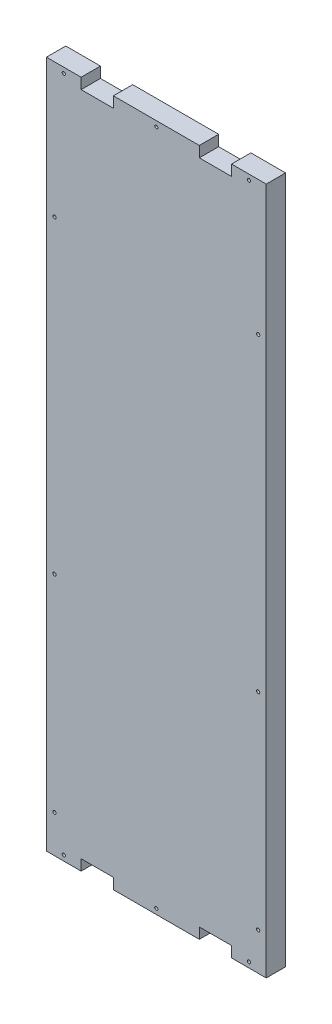
ISO-10303-21;
HEADER;
FILE_DESCRIPTION(('STEP AP214'),'2;1');
FILE_NAME('part.step','',(''),(''),'','','');
FILE_SCHEMA(('AUTOMOTIVE_DESIGN { 1 0 10303 214 1 1 1 1 }'));
ENDSEC;
DATA;
#1=APPLICATION_CONTEXT('core data for automotive mechanical design processes');
#2=APPLICATION_PROTOCOL_DEFINITION('international standard','automotive_design',2000,#1);
#3=PRODUCT_CONTEXT('',#1,'mechanical');
#4=PRODUCT('Part','Part','',(#3));
#5=PRODUCT_RELATED_PRODUCT_CATEGORY('part','',(#4));
#6=PRODUCT_DEFINITION_FORMATION('','',#4);
#7=PRODUCT_DEFINITION_CONTEXT('part definition',#1,'design');
#8=PRODUCT_DEFINITION('design','',#6,#7);
#9=PRODUCT_DEFINITION_SHAPE('','',#8);
#10=(LENGTH_UNIT() NAMED_UNIT(*) SI_UNIT(.MILLI.,.METRE.));
#11=(NAMED_UNIT(*) PLANE_ANGLE_UNIT() SI_UNIT($,.RADIAN.));
#12=(NAMED_UNIT(*) SI_UNIT($,.STERADIAN.) SOLID_ANGLE_UNIT());
#13=UNCERTAINTY_MEASURE_WITH_UNIT(LENGTH_MEASURE(1.E-05),#10,'distance_accuracy_value','');
#14=(GEOMETRIC_REPRESENTATION_CONTEXT(3) GLOBAL_UNCERTAINTY_ASSIGNED_CONTEXT((#13)) GLOBAL_UNIT_ASSIGNED_CONTEXT((#10,
#11,#12)) REPRESENTATION_CONTEXT('',''));
#15=CARTESIAN_POINT('',(0.,0.,0.));
#16=DIRECTION('',(0.,0.,1.));
#17=DIRECTION('',(1.,0.,0.));
#18=AXIS2_PLACEMENT_3D('',#15,#16,#17);
#19=CARTESIAN_POINT('',(-5.29999999999925,-36.5,18.));
#20=DIRECTION('',(0.,1.,0.));
#21=DIRECTION('',(0.,0.,1.));
#22=AXIS2_PLACEMENT_3D('',#19,#20,#21);
#23=PLANE('',#22);
#24=DIRECTION('',(1.,0.,0.));
#25=VECTOR('',#24,1.);
#26=CARTESIAN_POINT('',(-5.29999999999925,-36.5,18.));
#27=LINE('',#26,#25);
#28=CARTESIAN_POINT('',(167.000000000001,-36.5,18.));
#29=VERTEX_POINT('',#28);
#30=CARTESIAN_POINT('',(199.300000000001,-36.5,18.));
#31=VERTEX_POINT('',#30);
#32=EDGE_CURVE('E335',#29,#31,#27,.T.);
#33=ORIENTED_EDGE('',*,*,#32,.F.);
#34=DIRECTION('',(0.,0.,-1.));
#35=VECTOR('',#34,1.);
#36=CARTESIAN_POINT('',(167.000000000001,-36.5,18.));
#37=LINE('',#36,#35);
#38=CARTESIAN_POINT('',(167.000000000001,-36.5,0.));
#39=VERTEX_POINT('',#38);
#40=EDGE_CURVE('E244',#29,#39,#37,.T.);
#41=ORIENTED_EDGE('',*,*,#40,.T.);
#42=DIRECTION('',(1.,0.,0.));
#43=VECTOR('',#42,1.);
#44=CARTESIAN_POINT('',(-5.29999999999925,-36.5,0.));
#45=LINE('',#44,#43);
#46=CARTESIAN_POINT('',(199.300000000001,-36.5,0.));
#47=VERTEX_POINT('',#46);
#48=EDGE_CURVE('E353',#39,#47,#45,.T.);
#49=ORIENTED_EDGE('',*,*,#48,.T.);
#50=DIRECTION('',(0.,0.,-1.));
#51=VECTOR('',#50,1.);
#52=CARTESIAN_POINT('',(199.300000000001,-36.5,18.));
#53=LINE('',#52,#51);
#54=EDGE_CURVE('E48',#31,#47,#53,.T.);
#55=ORIENTED_EDGE('',*,*,#54,.F.);
#56=EDGE_LOOP('',(#33,#41,#49,#55));
#57=FACE_BOUND('',#56,.T.);
#58=ADVANCED_FACE('F39',(#57),#23,.F.);
#59=CARTESIAN_POINT('',(-5.29999999999925,-36.5,0.));
#60=VERTEX_POINT('',#59);
#61=CARTESIAN_POINT('',(27.0000000000007,-36.5,0.));
#62=VERTEX_POINT('',#61);
#63=EDGE_CURVE('E354',#60,#62,#45,.T.);
#64=ORIENTED_EDGE('',*,*,#63,.T.);
#65=DIRECTION('',(0.,0.,-1.));
#66=VECTOR('',#65,1.);
#67=CARTESIAN_POINT('',(27.0000000000007,-36.5,18.));
#68=LINE('',#67,#66);
#69=CARTESIAN_POINT('',(27.0000000000007,-36.5,18.));
#70=VERTEX_POINT('',#69);
#71=EDGE_CURVE('E318',#70,#62,#68,.T.);
#72=ORIENTED_EDGE('',*,*,#71,.F.);
#73=CARTESIAN_POINT('',(-5.29999999999925,-36.5,18.));
#74=VERTEX_POINT('',#73);
#75=EDGE_CURVE('E337',#74,#70,#27,.T.);
#76=ORIENTED_EDGE('',*,*,#75,.F.);
#77=DIRECTION('',(0.,0.,-1.));
#78=VECTOR('',#77,1.);
#79=CARTESIAN_POINT('',(-5.29999999999925,-36.5,18.));
#80=LINE('',#79,#78);
#81=EDGE_CURVE('E11',#74,#60,#80,.T.);
#82=ORIENTED_EDGE('',*,*,#81,.T.);
#83=EDGE_LOOP('',(#64,#72,#76,#82));
#84=FACE_BOUND('',#83,.T.);
#85=ADVANCED_FACE('F401',(#84),#23,.F.);
#86=CARTESIAN_POINT('',(-5.29999999999926,603.5,18.));
#87=DIRECTION('',(0.,-1.,0.));
#88=DIRECTION('',(0.,0.,-1.));
#89=AXIS2_PLACEMENT_3D('',#86,#87,#88);
#90=PLANE('',#89);
#91=DIRECTION('',(-1.,0.,0.));
#92=VECTOR('',#91,1.);
#93=CARTESIAN_POINT('',(-5.29999999999926,603.5,18.));
#94=LINE('',#93,#92);
#95=CARTESIAN_POINT('',(27.0000000000007,603.5,18.));
#96=VERTEX_POINT('',#95);
#97=CARTESIAN_POINT('',(-5.29999999999926,603.5,18.));
#98=VERTEX_POINT('',#97);
#99=EDGE_CURVE('E345',#96,#98,#94,.T.);
#100=ORIENTED_EDGE('',*,*,#99,.F.);
#101=DIRECTION('',(0.,0.,-1.));
#102=VECTOR('',#101,1.);
#103=CARTESIAN_POINT('',(27.0000000000007,603.5,18.));
#104=LINE('',#103,#102);
#105=CARTESIAN_POINT('',(27.0000000000007,603.5,0.));
#106=VERTEX_POINT('',#105);
#107=EDGE_CURVE('E250',#96,#106,#104,.T.);
#108=ORIENTED_EDGE('',*,*,#107,.T.);
#109=DIRECTION('',(-1.,0.,0.));
#110=VECTOR('',#109,1.);
#111=CARTESIAN_POINT('',(-5.29999999999926,603.5,0.));
#112=LINE('',#111,#110);
#113=CARTESIAN_POINT('',(-5.29999999999926,603.5,0.));
#114=VERTEX_POINT('',#113);
#115=EDGE_CURVE('E362',#106,#114,#112,.T.);
#116=ORIENTED_EDGE('',*,*,#115,.T.);
#117=DIRECTION('',(0.,0.,-1.));
#118=VECTOR('',#117,1.);
#119=CARTESIAN_POINT('',(-5.29999999999926,603.5,18.));
#120=LINE('',#119,#118);
#121=EDGE_CURVE('E348',#98,#114,#120,.T.);
#122=ORIENTED_EDGE('',*,*,#121,.F.);
#123=EDGE_LOOP('',(#100,#108,#116,#122));
#124=FACE_BOUND('',#123,.T.);
#125=ADVANCED_FACE('F392',(#124),#90,.F.);
#126=CARTESIAN_POINT('',(199.300000000001,603.5,0.));
#127=VERTEX_POINT('',#126);
#128=CARTESIAN_POINT('',(167.000000000001,603.5,0.));
#129=VERTEX_POINT('',#128);
#130=EDGE_CURVE('E336',#127,#129,#112,.T.);
#131=ORIENTED_EDGE('',*,*,#130,.T.);
#132=DIRECTION('',(0.,0.,-1.));
#133=VECTOR('',#132,1.);
#134=CARTESIAN_POINT('',(167.000000000001,603.5,18.));
#135=LINE('',#134,#133);
#136=CARTESIAN_POINT('',(167.000000000001,603.5,18.));
#137=VERTEX_POINT('',#136);
#138=EDGE_CURVE('E216',#137,#129,#135,.T.);
#139=ORIENTED_EDGE('',*,*,#138,.F.);
#140=CARTESIAN_POINT('',(199.300000000001,603.5,18.));
#141=VERTEX_POINT('',#140);
#142=EDGE_CURVE('E199',#141,#137,#94,.T.);
#143=ORIENTED_EDGE('',*,*,#142,.F.);
#144=DIRECTION('',(0.,0.,-1.));
#145=VECTOR('',#144,1.);
#146=CARTESIAN_POINT('',(199.300000000001,603.5,18.));
#147=LINE('',#146,#145);
#148=EDGE_CURVE('E370',#141,#127,#147,.T.);
#149=ORIENTED_EDGE('',*,*,#148,.T.);
#150=EDGE_LOOP('',(#131,#139,#143,#149));
#151=FACE_BOUND('',#150,.T.);
#152=ADVANCED_FACE('F390',(#151),#90,.F.);
#153=CARTESIAN_POINT('',(-5.29999999999925,-36.5,18.));
#154=DIRECTION('',(1.,0.,0.));
#155=DIRECTION('',(0.,1.,0.));
#156=AXIS2_PLACEMENT_3D('',#153,#154,#155);
#157=PLANE('',#156);
#158=DIRECTION('',(0.,-1.,0.));
#159=VECTOR('',#158,1.);
#160=CARTESIAN_POINT('',(-5.29999999999925,-36.5,0.));
#161=LINE('',#160,#159);
#162=EDGE_CURVE('E321',#114,#60,#161,.T.);
#163=ORIENTED_EDGE('',*,*,#162,.T.);
#164=ORIENTED_EDGE('',*,*,#81,.F.);
#165=DIRECTION('',(0.,-1.,0.));
#166=VECTOR('',#165,1.);
#167=CARTESIAN_POINT('',(-5.29999999999925,-36.5,18.));
#168=LINE('',#167,#166);
#169=EDGE_CURVE('E331',#98,#74,#168,.T.);
#170=ORIENTED_EDGE('',*,*,#169,.F.);
#171=ORIENTED_EDGE('',*,*,#121,.T.);
#172=EDGE_LOOP('',(#163,#164,#170,#171));
#173=FACE_BOUND('',#172,.T.);
#174=ADVANCED_FACE('F41',(#173),#157,.F.);
#175=CARTESIAN_POINT('',(57.0000000000007,-36.5,0.));
#176=VERTEX_POINT('',#175);
#177=CARTESIAN_POINT('',(137.000000000001,-36.5,0.));
#178=VERTEX_POINT('',#177);
#179=EDGE_CURVE('E359',#176,#178,#45,.T.);
#180=ORIENTED_EDGE('',*,*,#179,.T.);
#181=DIRECTION('',(0.,0.,-1.));
#182=VECTOR('',#181,1.);
#183=CARTESIAN_POINT('',(137.000000000001,-36.5,18.));
#184=LINE('',#183,#182);
#185=CARTESIAN_POINT('',(137.000000000001,-36.5,18.));
#186=VERTEX_POINT('',#185);
#187=EDGE_CURVE('E275',#186,#178,#184,.T.);
#188=ORIENTED_EDGE('',*,*,#187,.F.);
#189=CARTESIAN_POINT('',(57.0000000000007,-36.5,18.));
#190=VERTEX_POINT('',#189);
#191=EDGE_CURVE('E342',#190,#186,#27,.T.);
#192=ORIENTED_EDGE('',*,*,#191,.F.);
#193=DIRECTION('',(0.,0.,-1.));
#194=VECTOR('',#193,1.);
#195=CARTESIAN_POINT('',(57.0000000000007,-36.5,18.));
#196=LINE('',#195,#194);
#197=EDGE_CURVE('E322',#190,#176,#196,.T.);
#198=ORIENTED_EDGE('',*,*,#197,.T.);
#199=EDGE_LOOP('',(#180,#188,#192,#198));
#200=FACE_BOUND('',#199,.T.);
#201=ADVANCED_FACE('F399',(#200),#23,.F.);
#202=CARTESIAN_POINT('',(199.300000000001,-36.5,18.));
#203=DIRECTION('',(-1.,0.,0.));
#204=DIRECTION('',(0.,0.,1.));
#205=AXIS2_PLACEMENT_3D('',#202,#203,#204);
#206=PLANE('',#205);
#207=DIRECTION('',(0.,1.,0.));
#208=VECTOR('',#207,1.);
#209=CARTESIAN_POINT('',(199.300000000001,-36.5,0.));
#210=LINE('',#209,#208);
#211=EDGE_CURVE('E358',#47,#127,#210,.T.);
#212=ORIENTED_EDGE('',*,*,#211,.T.);
#213=ORIENTED_EDGE('',*,*,#148,.F.);
#214=DIRECTION('',(0.,1.,0.));
#215=VECTOR('',#214,1.);
#216=CARTESIAN_POINT('',(199.300000000001,-36.5,18.));
#217=LINE('',#216,#215);
#218=EDGE_CURVE('E341',#31,#141,#217,.T.);
#219=ORIENTED_EDGE('',*,*,#218,.F.);
#220=ORIENTED_EDGE('',*,*,#54,.T.);
#221=EDGE_LOOP('',(#212,#213,#219,#220));
#222=FACE_BOUND('',#221,.T.);
#223=ADVANCED_FACE('F379',(#222),#206,.F.);
#224=CARTESIAN_POINT('',(137.000000000001,603.5,0.));
#225=VERTEX_POINT('',#224);
#226=CARTESIAN_POINT('',(57.0000000000007,603.5,0.));
#227=VERTEX_POINT('',#226);
#228=EDGE_CURVE('E366',#225,#227,#112,.T.);
#229=ORIENTED_EDGE('',*,*,#228,.T.);
#230=DIRECTION('',(0.,0.,-1.));
#231=VECTOR('',#230,1.);
#232=CARTESIAN_POINT('',(57.0000000000007,603.5,18.));
#233=LINE('',#232,#231);
#234=CARTESIAN_POINT('',(57.0000000000007,603.5,18.));
#235=VERTEX_POINT('',#234);
#236=EDGE_CURVE('E238',#235,#227,#233,.T.);
#237=ORIENTED_EDGE('',*,*,#236,.F.);
#238=CARTESIAN_POINT('',(137.000000000001,603.5,18.));
#239=VERTEX_POINT('',#238);
#240=EDGE_CURVE('E349',#239,#235,#94,.T.);
#241=ORIENTED_EDGE('',*,*,#240,.F.);
#242=DIRECTION('',(0.,0.,-1.));
#243=VECTOR('',#242,1.);
#244=CARTESIAN_POINT('',(137.000000000001,603.5,18.));
#245=LINE('',#244,#243);
#246=EDGE_CURVE('E220',#239,#225,#245,.T.);
#247=ORIENTED_EDGE('',*,*,#246,.T.);
#248=EDGE_LOOP('',(#229,#237,#241,#247));
#249=FACE_BOUND('',#248,.T.);
#250=ADVANCED_FACE('F394',(#249),#90,.F.);
#251=CARTESIAN_POINT('',(0.,0.,18.));
#252=DIRECTION('',(0.,0.,-1.));
#253=DIRECTION('',(-1.,0.,0.));
#254=AXIS2_PLACEMENT_3D('',#251,#252,#253);
#255=PLANE('',#254);
#256=CARTESIAN_POINT('',(97.0000000000007,-31.5,18.));
#257=DIRECTION('',(0.,0.,-1.));
#258=DIRECTION('',(-1.,0.,0.));
#259=AXIS2_PLACEMENT_3D('',#256,#257,#258);
#260=CIRCLE('',#259,1.5);
#261=CARTESIAN_POINT('',(95.5000000000007,-31.5,18.));
#262=VERTEX_POINT('',#261);
#263=EDGE_CURVE('E577',#262,#262,#260,.T.);
#264=ORIENTED_EDGE('',*,*,#263,.T.);
#265=EDGE_LOOP('',(#264));
#266=FACE_BOUND('',#265,.T.);
#267=CARTESIAN_POINT('',(183.150000000001,-31.5,18.));
#268=DIRECTION('',(0.,0.,-1.));
#269=DIRECTION('',(-1.,0.,0.));
#270=AXIS2_PLACEMENT_3D('',#267,#268,#269);
#271=CIRCLE('',#270,1.5);
#272=CARTESIAN_POINT('',(181.650000000001,-31.5,18.));
#273=VERTEX_POINT('',#272);
#274=EDGE_CURVE('E571',#273,#273,#271,.T.);
#275=ORIENTED_EDGE('',*,*,#274,.T.);
#276=EDGE_LOOP('',(#275));
#277=FACE_BOUND('',#276,.T.);
#278=CARTESIAN_POINT('',(10.8500000000007,-31.5,18.));
#279=DIRECTION('',(0.,0.,-1.));
#280=DIRECTION('',(-1.,0.,0.));
#281=AXIS2_PLACEMENT_3D('',#278,#279,#280);
#282=CIRCLE('',#281,1.5);
#283=CARTESIAN_POINT('',(9.35000000000074,-31.5,18.));
#284=VERTEX_POINT('',#283);
#285=EDGE_CURVE('E565',#284,#284,#282,.T.);
#286=ORIENTED_EDGE('',*,*,#285,.T.);
#287=EDGE_LOOP('',(#286));
#288=FACE_BOUND('',#287,.T.);
#289=CARTESIAN_POINT('',(10.8500000000009,598.5,18.));
#290=DIRECTION('',(0.,0.,-1.));
#291=DIRECTION('',(-1.,0.,0.));
#292=AXIS2_PLACEMENT_3D('',#289,#290,#291);
#293=CIRCLE('',#292,1.5);
#294=CARTESIAN_POINT('',(9.35000000000091,598.5,18.));
#295=VERTEX_POINT('',#294);
#296=EDGE_CURVE('E559',#295,#295,#293,.T.);
#297=ORIENTED_EDGE('',*,*,#296,.T.);
#298=EDGE_LOOP('',(#297));
#299=FACE_BOUND('',#298,.T.);
#300=CARTESIAN_POINT('',(183.150000000001,598.5,18.));
#301=DIRECTION('',(0.,0.,-1.));
#302=DIRECTION('',(-1.,0.,0.));
#303=AXIS2_PLACEMENT_3D('',#300,#301,#302);
#304=CIRCLE('',#303,1.5);
#305=CARTESIAN_POINT('',(181.650000000001,598.5,18.));
#306=VERTEX_POINT('',#305);
#307=EDGE_CURVE('E553',#306,#306,#304,.T.);
#308=ORIENTED_EDGE('',*,*,#307,.T.);
#309=EDGE_LOOP('',(#308));
#310=FACE_BOUND('',#309,.T.);
#311=CARTESIAN_POINT('',(97.0000000000009,598.5,18.));
#312=DIRECTION('',(0.,0.,-1.));
#313=DIRECTION('',(-1.,0.,0.));
#314=AXIS2_PLACEMENT_3D('',#311,#312,#313);
#315=CIRCLE('',#314,1.5);
#316=CARTESIAN_POINT('',(95.5000000000009,598.5,18.));
#317=VERTEX_POINT('',#316);
#318=EDGE_CURVE('E547',#317,#317,#315,.T.);
#319=ORIENTED_EDGE('',*,*,#318,.T.);
#320=EDGE_LOOP('',(#319));
#321=FACE_BOUND('',#320,.T.);
#322=CARTESIAN_POINT('',(2.20000000000076,-1.50000000000006,18.));
#323=DIRECTION('',(0.,0.,-1.));
#324=DIRECTION('',(-1.,0.,0.));
#325=AXIS2_PLACEMENT_3D('',#322,#323,#324);
#326=CIRCLE('',#325,1.5);
#327=CARTESIAN_POINT('',(0.700000000000765,-1.50000000000006,18.));
#328=VERTEX_POINT('',#327);
#329=EDGE_CURVE('E541',#328,#328,#326,.T.);
#330=ORIENTED_EDGE('',*,*,#329,.T.);
#331=EDGE_LOOP('',(#330));
#332=FACE_BOUND('',#331,.T.);
#333=CARTESIAN_POINT('',(191.800000000001,-1.49999999999995,18.));
#334=DIRECTION('',(0.,0.,-1.));
#335=DIRECTION('',(-1.,0.,0.));
#336=AXIS2_PLACEMENT_3D('',#333,#334,#335);
#337=CIRCLE('',#336,1.5);
#338=CARTESIAN_POINT('',(190.300000000001,-1.49999999999995,18.));
#339=VERTEX_POINT('',#338);
#340=EDGE_CURVE('E535',#339,#339,#337,.T.);
#341=ORIENTED_EDGE('',*,*,#340,.T.);
#342=EDGE_LOOP('',(#341));
#343=FACE_BOUND('',#342,.T.);
#344=CARTESIAN_POINT('',(191.800000000001,190.5,18.));
#345=DIRECTION('',(0.,0.,-1.));
#346=DIRECTION('',(-1.,0.,0.));
#347=AXIS2_PLACEMENT_3D('',#344,#345,#346);
#348=CIRCLE('',#347,1.5);
#349=CARTESIAN_POINT('',(190.300000000001,190.5,18.));
#350=VERTEX_POINT('',#349);
#351=EDGE_CURVE('E529',#350,#350,#348,.T.);
#352=ORIENTED_EDGE('',*,*,#351,.T.);
#353=EDGE_LOOP('',(#352));
#354=FACE_BOUND('',#353,.T.);
#355=CARTESIAN_POINT('',(191.800000000001,478.5,18.));
#356=DIRECTION('',(0.,0.,-1.));
#357=DIRECTION('',(-1.,0.,0.));
#358=AXIS2_PLACEMENT_3D('',#355,#356,#357);
#359=CIRCLE('',#358,1.5);
#360=CARTESIAN_POINT('',(190.300000000001,478.5,18.));
#361=VERTEX_POINT('',#360);
#362=EDGE_CURVE('E523',#361,#361,#359,.T.);
#363=ORIENTED_EDGE('',*,*,#362,.T.);
#364=EDGE_LOOP('',(#363));
#365=FACE_BOUND('',#364,.T.);
#366=CARTESIAN_POINT('',(2.20000000000071,478.5,18.));
#367=DIRECTION('',(0.,0.,-1.));
#368=DIRECTION('',(-1.,0.,0.));
#369=AXIS2_PLACEMENT_3D('',#366,#367,#368);
#370=CIRCLE('',#369,1.5);
#371=CARTESIAN_POINT('',(0.70000000000071,478.5,18.));
#372=VERTEX_POINT('',#371);
#373=EDGE_CURVE('E514',#372,#372,#370,.T.);
#374=ORIENTED_EDGE('',*,*,#373,.T.);
#375=EDGE_LOOP('',(#374));
#376=FACE_BOUND('',#375,.T.);
#377=CARTESIAN_POINT('',(2.20000000000071,190.5,18.));
#378=DIRECTION('',(0.,0.,-1.));
#379=DIRECTION('',(-1.,0.,0.));
#380=AXIS2_PLACEMENT_3D('',#377,#378,#379);
#381=CIRCLE('',#380,1.5);
#382=CARTESIAN_POINT('',(0.70000000000071,190.5,18.));
#383=VERTEX_POINT('',#382);
#384=EDGE_CURVE('E207',#383,#383,#381,.T.);
#385=ORIENTED_EDGE('',*,*,#384,.T.);
#386=EDGE_LOOP('',(#385));
#387=FACE_BOUND('',#386,.T.);
#388=DIRECTION('',(-1.,0.,0.));
#389=VECTOR('',#388,1.);
#390=CARTESIAN_POINT('',(27.0000000000007,593.5,18.));
#391=LINE('',#390,#389);
#392=CARTESIAN_POINT('',(57.0000000000007,593.5,18.));
#393=VERTEX_POINT('',#392);
#394=CARTESIAN_POINT('',(27.0000000000007,593.5,18.));
#395=VERTEX_POINT('',#394);
#396=EDGE_CURVE('E230',#393,#395,#391,.T.);
#397=ORIENTED_EDGE('',*,*,#396,.T.);
#398=DIRECTION('',(0.,1.,0.));
#399=VECTOR('',#398,1.);
#400=CARTESIAN_POINT('',(27.0000000000007,603.5,18.));
#401=LINE('',#400,#399);
#402=EDGE_CURVE('E234',#395,#96,#401,.T.);
#403=ORIENTED_EDGE('',*,*,#402,.T.);
#404=ORIENTED_EDGE('',*,*,#99,.T.);
#405=ORIENTED_EDGE('',*,*,#169,.T.);
#406=ORIENTED_EDGE('',*,*,#75,.T.);
#407=DIRECTION('',(0.,1.,0.));
#408=VECTOR('',#407,1.);
#409=CARTESIAN_POINT('',(27.0000000000007,-36.5,18.));
#410=LINE('',#409,#408);
#411=CARTESIAN_POINT('',(27.0000000000007,-26.5,18.));
#412=VERTEX_POINT('',#411);
#413=EDGE_CURVE('E296',#70,#412,#410,.T.);
#414=ORIENTED_EDGE('',*,*,#413,.T.);
#415=DIRECTION('',(1.,0.,0.));
#416=VECTOR('',#415,1.);
#417=CARTESIAN_POINT('',(27.0000000000007,-26.5,18.));
#418=LINE('',#417,#416);
#419=CARTESIAN_POINT('',(57.0000000000007,-26.5,18.));
#420=VERTEX_POINT('',#419);
#421=EDGE_CURVE('E300',#412,#420,#418,.T.);
#422=ORIENTED_EDGE('',*,*,#421,.T.);
#423=DIRECTION('',(0.,-1.,0.));
#424=VECTOR('',#423,1.);
#425=CARTESIAN_POINT('',(57.0000000000007,-36.5,18.));
#426=LINE('',#425,#424);
#427=EDGE_CURVE('E305',#420,#190,#426,.T.);
#428=ORIENTED_EDGE('',*,*,#427,.T.);
#429=ORIENTED_EDGE('',*,*,#191,.T.);
#430=DIRECTION('',(0.,1.,0.));
#431=VECTOR('',#430,1.);
#432=CARTESIAN_POINT('',(137.000000000001,-36.5,18.));
#433=LINE('',#432,#431);
#434=CARTESIAN_POINT('',(137.000000000001,-26.5,18.));
#435=VERTEX_POINT('',#434);
#436=EDGE_CURVE('E262',#186,#435,#433,.T.);
#437=ORIENTED_EDGE('',*,*,#436,.T.);
#438=DIRECTION('',(1.,0.,0.));
#439=VECTOR('',#438,1.);
#440=CARTESIAN_POINT('',(167.000000000001,-26.5,18.));
#441=LINE('',#440,#439);
#442=CARTESIAN_POINT('',(167.000000000001,-26.5,18.));
#443=VERTEX_POINT('',#442);
#444=EDGE_CURVE('E266',#435,#443,#441,.T.);
#445=ORIENTED_EDGE('',*,*,#444,.T.);
#446=DIRECTION('',(0.,-1.,0.));
#447=VECTOR('',#446,1.);
#448=CARTESIAN_POINT('',(167.000000000001,-36.5,18.));
#449=LINE('',#448,#447);
#450=EDGE_CURVE('E271',#443,#29,#449,.T.);
#451=ORIENTED_EDGE('',*,*,#450,.T.);
#452=ORIENTED_EDGE('',*,*,#32,.T.);
#453=ORIENTED_EDGE('',*,*,#218,.T.);
#454=ORIENTED_EDGE('',*,*,#142,.T.);
#455=DIRECTION('',(0.,-1.,0.));
#456=VECTOR('',#455,1.);
#457=CARTESIAN_POINT('',(167.000000000001,603.5,18.));
#458=LINE('',#457,#456);
#459=CARTESIAN_POINT('',(167.000000000001,593.5,18.));
#460=VERTEX_POINT('',#459);
#461=EDGE_CURVE('E178',#137,#460,#458,.T.);
#462=ORIENTED_EDGE('',*,*,#461,.T.);
#463=DIRECTION('',(-1.,0.,0.));
#464=VECTOR('',#463,1.);
#465=CARTESIAN_POINT('',(167.000000000001,593.5,18.));
#466=LINE('',#465,#464);
#467=CARTESIAN_POINT('',(137.000000000001,593.5,18.));
#468=VERTEX_POINT('',#467);
#469=EDGE_CURVE('E188',#460,#468,#466,.T.);
#470=ORIENTED_EDGE('',*,*,#469,.T.);
#471=DIRECTION('',(0.,1.,0.));
#472=VECTOR('',#471,1.);
#473=CARTESIAN_POINT('',(137.000000000001,603.5,18.));
#474=LINE('',#473,#472);
#475=EDGE_CURVE('E185',#468,#239,#474,.T.);
#476=ORIENTED_EDGE('',*,*,#475,.T.);
#477=ORIENTED_EDGE('',*,*,#240,.T.);
#478=DIRECTION('',(0.,-1.,0.));
#479=VECTOR('',#478,1.);
#480=CARTESIAN_POINT('',(57.0000000000007,603.5,18.));
#481=LINE('',#480,#479);
#482=EDGE_CURVE('E226',#235,#393,#481,.T.);
#483=ORIENTED_EDGE('',*,*,#482,.T.);
#484=EDGE_LOOP('',(#397,#403,#404,#405,#406,#414,#422,#428,#429,#437,#445,#451,#452,#453,#454,
#462,#470,#476,#477,#483));
#485=FACE_BOUND('',#484,.T.);
#486=ADVANCED_FACE('F197',(#266,#277,#288,#299,#310,#321,#332,#343,#354,#365,#376,#387,#485),
#255,.F.);
#487=CARTESIAN_POINT('',(0.,0.,0.));
#488=DIRECTION('',(0.,0.,-1.));
#489=DIRECTION('',(-1.,0.,0.));
#490=AXIS2_PLACEMENT_3D('',#487,#488,#489);
#491=PLANE('',#490);
#492=CARTESIAN_POINT('',(97.0000000000007,-31.5,0.));
#493=DIRECTION('',(0.,0.,-1.));
#494=DIRECTION('',(-1.,0.,0.));
#495=AXIS2_PLACEMENT_3D('',#492,#493,#494);
#496=CIRCLE('',#495,1.49999999999999);
#497=CARTESIAN_POINT('',(95.5000000000007,-31.5,0.));
#498=VERTEX_POINT('',#497);
#499=EDGE_CURVE('E468',#498,#498,#496,.T.);
#500=ORIENTED_EDGE('',*,*,#499,.F.);
#501=EDGE_LOOP('',(#500));
#502=FACE_BOUND('',#501,.T.);
#503=CARTESIAN_POINT('',(183.150000000001,-31.5,0.));
#504=DIRECTION('',(0.,0.,-1.));
#505=DIRECTION('',(-1.,0.,0.));
#506=AXIS2_PLACEMENT_3D('',#503,#504,#505);
#507=CIRCLE('',#506,1.5);
#508=CARTESIAN_POINT('',(181.650000000001,-31.5,0.));
#509=VERTEX_POINT('',#508);
#510=EDGE_CURVE('E472',#509,#509,#507,.T.);
#511=ORIENTED_EDGE('',*,*,#510,.F.);
#512=EDGE_LOOP('',(#511));
#513=FACE_BOUND('',#512,.T.);
#514=CARTESIAN_POINT('',(10.8500000000007,-31.5,0.));
#515=DIRECTION('',(0.,0.,-1.));
#516=DIRECTION('',(-1.,0.,0.));
#517=AXIS2_PLACEMENT_3D('',#514,#515,#516);
#518=CIRCLE('',#517,1.49999999999999);
#519=CARTESIAN_POINT('',(9.35000000000075,-31.5,0.));
#520=VERTEX_POINT('',#519);
#521=EDGE_CURVE('E476',#520,#520,#518,.T.);
#522=ORIENTED_EDGE('',*,*,#521,.F.);
#523=EDGE_LOOP('',(#522));
#524=FACE_BOUND('',#523,.T.);
#525=CARTESIAN_POINT('',(10.8500000000009,598.5,0.));
#526=DIRECTION('',(0.,0.,-1.));
#527=DIRECTION('',(-1.,0.,0.));
#528=AXIS2_PLACEMENT_3D('',#525,#526,#527);
#529=CIRCLE('',#528,1.49999999999999);
#530=CARTESIAN_POINT('',(9.35000000000092,598.5,0.));
#531=VERTEX_POINT('',#530);
#532=EDGE_CURVE('E480',#531,#531,#529,.T.);
#533=ORIENTED_EDGE('',*,*,#532,.F.);
#534=EDGE_LOOP('',(#533));
#535=FACE_BOUND('',#534,.T.);
#536=CARTESIAN_POINT('',(183.150000000001,598.5,0.));
#537=DIRECTION('',(0.,0.,-1.));
#538=DIRECTION('',(-1.,0.,0.));
#539=AXIS2_PLACEMENT_3D('',#536,#537,#538);
#540=CIRCLE('',#539,1.5);
#541=CARTESIAN_POINT('',(181.650000000001,598.5,0.));
#542=VERTEX_POINT('',#541);
#543=EDGE_CURVE('E484',#542,#542,#540,.T.);
#544=ORIENTED_EDGE('',*,*,#543,.F.);
#545=EDGE_LOOP('',(#544));
#546=FACE_BOUND('',#545,.T.);
#547=CARTESIAN_POINT('',(97.0000000000009,598.5,0.));
#548=DIRECTION('',(0.,0.,-1.));
#549=DIRECTION('',(-1.,0.,0.));
#550=AXIS2_PLACEMENT_3D('',#547,#548,#549);
#551=CIRCLE('',#550,1.49999999999999);
#552=CARTESIAN_POINT('',(95.5000000000009,598.5,0.));
#553=VERTEX_POINT('',#552);
#554=EDGE_CURVE('E488',#553,#553,#551,.T.);
#555=ORIENTED_EDGE('',*,*,#554,.F.);
#556=EDGE_LOOP('',(#555));
#557=FACE_BOUND('',#556,.T.);
#558=CARTESIAN_POINT('',(2.20000000000076,-1.50000000000006,0.));
#559=DIRECTION('',(0.,0.,-1.));
#560=DIRECTION('',(-1.,0.,0.));
#561=AXIS2_PLACEMENT_3D('',#558,#559,#560);
#562=CIRCLE('',#561,1.49999999999999);
#563=CARTESIAN_POINT('',(0.700000000000775,-1.50000000000006,0.));
#564=VERTEX_POINT('',#563);
#565=EDGE_CURVE('E492',#564,#564,#562,.T.);
#566=ORIENTED_EDGE('',*,*,#565,.F.);
#567=EDGE_LOOP('',(#566));
#568=FACE_BOUND('',#567,.T.);
#569=CARTESIAN_POINT('',(191.800000000001,-1.49999999999995,0.));
#570=DIRECTION('',(0.,0.,-1.));
#571=DIRECTION('',(-1.,0.,0.));
#572=AXIS2_PLACEMENT_3D('',#569,#570,#571);
#573=CIRCLE('',#572,1.49999999999997);
#574=CARTESIAN_POINT('',(190.300000000001,-1.49999999999995,0.));
#575=VERTEX_POINT('',#574);
#576=EDGE_CURVE('E496',#575,#575,#573,.T.);
#577=ORIENTED_EDGE('',*,*,#576,.F.);
#578=EDGE_LOOP('',(#577));
#579=FACE_BOUND('',#578,.T.);
#580=CARTESIAN_POINT('',(191.800000000001,190.5,0.));
#581=DIRECTION('',(0.,0.,-1.));
#582=DIRECTION('',(-1.,0.,0.));
#583=AXIS2_PLACEMENT_3D('',#580,#581,#582);
#584=CIRCLE('',#583,1.49999999999997);
#585=CARTESIAN_POINT('',(190.300000000001,190.5,0.));
#586=VERTEX_POINT('',#585);
#587=EDGE_CURVE('E500',#586,#586,#584,.T.);
#588=ORIENTED_EDGE('',*,*,#587,.F.);
#589=EDGE_LOOP('',(#588));
#590=FACE_BOUND('',#589,.T.);
#591=CARTESIAN_POINT('',(191.800000000001,478.5,0.));
#592=DIRECTION('',(0.,0.,-1.));
#593=DIRECTION('',(-1.,0.,0.));
#594=AXIS2_PLACEMENT_3D('',#591,#592,#593);
#595=CIRCLE('',#594,1.49999999999997);
#596=CARTESIAN_POINT('',(190.300000000001,478.5,0.));
#597=VERTEX_POINT('',#596);
#598=EDGE_CURVE('E504',#597,#597,#595,.T.);
#599=ORIENTED_EDGE('',*,*,#598,.F.);
#600=EDGE_LOOP('',(#599));
#601=FACE_BOUND('',#600,.T.);
#602=CARTESIAN_POINT('',(2.20000000000071,478.5,0.));
#603=DIRECTION('',(0.,0.,-1.));
#604=DIRECTION('',(-1.,0.,0.));
#605=AXIS2_PLACEMENT_3D('',#602,#603,#604);
#606=CIRCLE('',#605,1.49999999999999);
#607=CARTESIAN_POINT('',(0.700000000000719,478.5,0.));
#608=VERTEX_POINT('',#607);
#609=EDGE_CURVE('E508',#608,#608,#606,.T.);
#610=ORIENTED_EDGE('',*,*,#609,.F.);
#611=EDGE_LOOP('',(#610));
#612=FACE_BOUND('',#611,.T.);
#613=CARTESIAN_POINT('',(2.20000000000071,190.5,0.));
#614=DIRECTION('',(0.,0.,-1.));
#615=DIRECTION('',(-1.,0.,0.));
#616=AXIS2_PLACEMENT_3D('',#613,#614,#615);
#617=CIRCLE('',#616,1.49999999999999);
#618=CARTESIAN_POINT('',(0.700000000000719,190.5,0.));
#619=VERTEX_POINT('',#618);
#620=EDGE_CURVE('E511',#619,#619,#617,.T.);
#621=ORIENTED_EDGE('',*,*,#620,.F.);
#622=EDGE_LOOP('',(#621));
#623=FACE_BOUND('',#622,.T.);
#624=DIRECTION('',(0.,1.,0.));
#625=VECTOR('',#624,1.);
#626=CARTESIAN_POINT('',(27.0000000000007,603.5,0.));
#627=LINE('',#626,#625);
#628=CARTESIAN_POINT('',(27.0000000000007,593.5,0.));
#629=VERTEX_POINT('',#628);
#630=EDGE_CURVE('E231',#629,#106,#627,.T.);
#631=ORIENTED_EDGE('',*,*,#630,.F.);
#632=DIRECTION('',(-1.,0.,0.));
#633=VECTOR('',#632,1.);
#634=CARTESIAN_POINT('',(27.0000000000007,593.5,0.));
#635=LINE('',#634,#633);
#636=CARTESIAN_POINT('',(57.0000000000007,593.5,0.));
#637=VERTEX_POINT('',#636);
#638=EDGE_CURVE('E243',#637,#629,#635,.T.);
#639=ORIENTED_EDGE('',*,*,#638,.F.);
#640=DIRECTION('',(0.,-1.,0.));
#641=VECTOR('',#640,1.);
#642=CARTESIAN_POINT('',(57.0000000000007,603.5,0.));
#643=LINE('',#642,#641);
#644=EDGE_CURVE('E239',#227,#637,#643,.T.);
#645=ORIENTED_EDGE('',*,*,#644,.F.);
#646=ORIENTED_EDGE('',*,*,#228,.F.);
#647=DIRECTION('',(0.,1.,0.));
#648=VECTOR('',#647,1.);
#649=CARTESIAN_POINT('',(137.000000000001,603.5,0.));
#650=LINE('',#649,#648);
#651=CARTESIAN_POINT('',(137.000000000001,593.5,0.));
#652=VERTEX_POINT('',#651);
#653=EDGE_CURVE('E201',#652,#225,#650,.T.);
#654=ORIENTED_EDGE('',*,*,#653,.F.);
#655=DIRECTION('',(-1.,0.,0.));
#656=VECTOR('',#655,1.);
#657=CARTESIAN_POINT('',(167.000000000001,593.5,0.));
#658=LINE('',#657,#656);
#659=CARTESIAN_POINT('',(167.000000000001,593.5,0.));
#660=VERTEX_POINT('',#659);
#661=EDGE_CURVE('E204',#660,#652,#658,.T.);
#662=ORIENTED_EDGE('',*,*,#661,.F.);
#663=DIRECTION('',(0.,-1.,0.));
#664=VECTOR('',#663,1.);
#665=CARTESIAN_POINT('',(167.000000000001,603.5,0.));
#666=LINE('',#665,#664);
#667=EDGE_CURVE('E55',#129,#660,#666,.T.);
#668=ORIENTED_EDGE('',*,*,#667,.F.);
#669=ORIENTED_EDGE('',*,*,#130,.F.);
#670=ORIENTED_EDGE('',*,*,#211,.F.);
#671=ORIENTED_EDGE('',*,*,#48,.F.);
#672=DIRECTION('',(0.,-1.,0.));
#673=VECTOR('',#672,1.);
#674=CARTESIAN_POINT('',(167.000000000001,-36.5,0.));
#675=LINE('',#674,#673);
#676=CARTESIAN_POINT('',(167.000000000001,-26.5,0.));
#677=VERTEX_POINT('',#676);
#678=EDGE_CURVE('E267',#677,#39,#675,.T.);
#679=ORIENTED_EDGE('',*,*,#678,.F.);
#680=DIRECTION('',(1.,0.,0.));
#681=VECTOR('',#680,1.);
#682=CARTESIAN_POINT('',(167.000000000001,-26.5,0.));
#683=LINE('',#682,#681);
#684=CARTESIAN_POINT('',(137.000000000001,-26.5,0.));
#685=VERTEX_POINT('',#684);
#686=EDGE_CURVE('E279',#685,#677,#683,.T.);
#687=ORIENTED_EDGE('',*,*,#686,.F.);
#688=DIRECTION('',(0.,1.,0.));
#689=VECTOR('',#688,1.);
#690=CARTESIAN_POINT('',(137.000000000001,-36.5,0.));
#691=LINE('',#690,#689);
#692=EDGE_CURVE('E219',#178,#685,#691,.T.);
#693=ORIENTED_EDGE('',*,*,#692,.F.);
#694=ORIENTED_EDGE('',*,*,#179,.F.);
#695=DIRECTION('',(0.,-1.,0.));
#696=VECTOR('',#695,1.);
#697=CARTESIAN_POINT('',(57.0000000000007,-36.5,0.));
#698=LINE('',#697,#696);
#699=CARTESIAN_POINT('',(57.0000000000007,-26.5,0.));
#700=VERTEX_POINT('',#699);
#701=EDGE_CURVE('E301',#700,#176,#698,.T.);
#702=ORIENTED_EDGE('',*,*,#701,.F.);
#703=DIRECTION('',(1.,0.,0.));
#704=VECTOR('',#703,1.);
#705=CARTESIAN_POINT('',(27.0000000000007,-26.5,0.));
#706=LINE('',#705,#704);
#707=CARTESIAN_POINT('',(27.0000000000007,-26.5,0.));
#708=VERTEX_POINT('',#707);
#709=EDGE_CURVE('E312',#708,#700,#706,.T.);
#710=ORIENTED_EDGE('',*,*,#709,.F.);
#711=DIRECTION('',(0.,1.,0.));
#712=VECTOR('',#711,1.);
#713=CARTESIAN_POINT('',(27.0000000000007,-36.5,0.));
#714=LINE('',#713,#712);
#715=EDGE_CURVE('E63',#62,#708,#714,.T.);
#716=ORIENTED_EDGE('',*,*,#715,.F.);
#717=ORIENTED_EDGE('',*,*,#63,.F.);
#718=ORIENTED_EDGE('',*,*,#162,.F.);
#719=ORIENTED_EDGE('',*,*,#115,.F.);
#720=EDGE_LOOP('',(#631,#639,#645,#646,#654,#662,#668,#669,#670,#671,#679,#687,#693,#694,#702,
#710,#716,#717,#718,#719));
#721=FACE_BOUND('',#720,.T.);
#722=ADVANCED_FACE('F387',(#502,#513,#524,#535,#546,#557,#568,#579,#590,#601,#612,#623,#721),
#491,.T.);
#723=CARTESIAN_POINT('',(27.0000000000007,-36.5,18.));
#724=DIRECTION('',(-1.,0.,0.));
#725=DIRECTION('',(0.,0.,1.));
#726=AXIS2_PLACEMENT_3D('',#723,#724,#725);
#727=PLANE('',#726);
#728=ORIENTED_EDGE('',*,*,#715,.T.);
#729=DIRECTION('',(0.,0.,-1.));
#730=VECTOR('',#729,1.);
#731=CARTESIAN_POINT('',(27.0000000000007,-26.5,18.));
#732=LINE('',#731,#730);
#733=EDGE_CURVE('E309',#412,#708,#732,.T.);
#734=ORIENTED_EDGE('',*,*,#733,.F.);
#735=ORIENTED_EDGE('',*,*,#413,.F.);
#736=ORIENTED_EDGE('',*,*,#71,.T.);
#737=EDGE_LOOP('',(#728,#734,#735,#736));
#738=FACE_BOUND('',#737,.T.);
#739=ADVANCED_FACE('F452',(#738),#727,.F.);
#740=CARTESIAN_POINT('',(57.0000000000007,-36.5,18.));
#741=DIRECTION('',(1.,0.,0.));
#742=DIRECTION('',(0.,0.,-1.));
#743=AXIS2_PLACEMENT_3D('',#740,#741,#742);
#744=PLANE('',#743);
#745=ORIENTED_EDGE('',*,*,#701,.T.);
#746=ORIENTED_EDGE('',*,*,#197,.F.);
#747=ORIENTED_EDGE('',*,*,#427,.F.);
#748=DIRECTION('',(0.,0.,-1.));
#749=VECTOR('',#748,1.);
#750=CARTESIAN_POINT('',(57.0000000000007,-26.5,18.));
#751=LINE('',#750,#749);
#752=EDGE_CURVE('E326',#420,#700,#751,.T.);
#753=ORIENTED_EDGE('',*,*,#752,.T.);
#754=EDGE_LOOP('',(#745,#746,#747,#753));
#755=FACE_BOUND('',#754,.T.);
#756=ADVANCED_FACE('F448',(#755),#744,.F.);
#757=CARTESIAN_POINT('',(27.0000000000007,-26.5,18.));
#758=DIRECTION('',(0.,1.,0.));
#759=DIRECTION('',(0.,0.,1.));
#760=AXIS2_PLACEMENT_3D('',#757,#758,#759);
#761=PLANE('',#760);
#762=ORIENTED_EDGE('',*,*,#709,.T.);
#763=ORIENTED_EDGE('',*,*,#752,.F.);
#764=ORIENTED_EDGE('',*,*,#421,.F.);
#765=ORIENTED_EDGE('',*,*,#733,.T.);
#766=EDGE_LOOP('',(#762,#763,#764,#765));
#767=FACE_BOUND('',#766,.T.);
#768=ADVANCED_FACE('F451',(#767),#761,.F.);
#769=CARTESIAN_POINT('',(167.000000000001,603.5,18.));
#770=DIRECTION('',(1.,0.,0.));
#771=DIRECTION('',(0.,0.,-1.));
#772=AXIS2_PLACEMENT_3D('',#769,#770,#771);
#773=PLANE('',#772);
#774=ORIENTED_EDGE('',*,*,#667,.T.);
#775=DIRECTION('',(0.,0.,-1.));
#776=VECTOR('',#775,1.);
#777=CARTESIAN_POINT('',(167.000000000001,593.5,18.));
#778=LINE('',#777,#776);
#779=EDGE_CURVE('E174',#460,#660,#778,.T.);
#780=ORIENTED_EDGE('',*,*,#779,.F.);
#781=ORIENTED_EDGE('',*,*,#461,.F.);
#782=ORIENTED_EDGE('',*,*,#138,.T.);
#783=EDGE_LOOP('',(#774,#780,#781,#782));
#784=FACE_BOUND('',#783,.T.);
#785=ADVANCED_FACE('F176',(#784),#773,.F.);
#786=CARTESIAN_POINT('',(137.000000000001,603.5,18.));
#787=DIRECTION('',(-1.,0.,0.));
#788=DIRECTION('',(0.,0.,1.));
#789=AXIS2_PLACEMENT_3D('',#786,#787,#788);
#790=PLANE('',#789);
#791=ORIENTED_EDGE('',*,*,#653,.T.);
#792=ORIENTED_EDGE('',*,*,#246,.F.);
#793=ORIENTED_EDGE('',*,*,#475,.F.);
#794=DIRECTION('',(0.,0.,-1.));
#795=VECTOR('',#794,1.);
#796=CARTESIAN_POINT('',(137.000000000001,593.5,18.));
#797=LINE('',#796,#795);
#798=EDGE_CURVE('E184',#468,#652,#797,.T.);
#799=ORIENTED_EDGE('',*,*,#798,.T.);
#800=EDGE_LOOP('',(#791,#792,#793,#799));
#801=FACE_BOUND('',#800,.T.);
#802=ADVANCED_FACE('F636',(#801),#790,.F.);
#803=CARTESIAN_POINT('',(167.000000000001,593.5,18.));
#804=DIRECTION('',(0.,-1.,0.));
#805=DIRECTION('',(0.,0.,-1.));
#806=AXIS2_PLACEMENT_3D('',#803,#804,#805);
#807=PLANE('',#806);
#808=ORIENTED_EDGE('',*,*,#661,.T.);
#809=ORIENTED_EDGE('',*,*,#798,.F.);
#810=ORIENTED_EDGE('',*,*,#469,.F.);
#811=ORIENTED_EDGE('',*,*,#779,.T.);
#812=EDGE_LOOP('',(#808,#809,#810,#811));
#813=FACE_BOUND('',#812,.T.);
#814=ADVANCED_FACE('F189',(#813),#807,.F.);
#815=CARTESIAN_POINT('',(167.000000000001,-36.5,18.));
#816=DIRECTION('',(1.,0.,0.));
#817=DIRECTION('',(0.,0.,-1.));
#818=AXIS2_PLACEMENT_3D('',#815,#816,#817);
#819=PLANE('',#818);
#820=ORIENTED_EDGE('',*,*,#678,.T.);
#821=ORIENTED_EDGE('',*,*,#40,.F.);
#822=ORIENTED_EDGE('',*,*,#450,.F.);
#823=DIRECTION('',(0.,0.,-1.));
#824=VECTOR('',#823,1.);
#825=CARTESIAN_POINT('',(167.000000000001,-26.5,18.));
#826=LINE('',#825,#824);
#827=EDGE_CURVE('E288',#443,#677,#826,.T.);
#828=ORIENTED_EDGE('',*,*,#827,.T.);
#829=EDGE_LOOP('',(#820,#821,#822,#828));
#830=FACE_BOUND('',#829,.T.);
#831=ADVANCED_FACE('F428',(#830),#819,.F.);
#832=CARTESIAN_POINT('',(167.000000000001,-26.5,18.));
#833=DIRECTION('',(0.,1.,0.));
#834=DIRECTION('',(-1.,0.,0.));
#835=AXIS2_PLACEMENT_3D('',#832,#833,#834);
#836=PLANE('',#835);
#837=ORIENTED_EDGE('',*,*,#686,.T.);
#838=ORIENTED_EDGE('',*,*,#827,.F.);
#839=ORIENTED_EDGE('',*,*,#444,.F.);
#840=DIRECTION('',(0.,0.,-1.));
#841=VECTOR('',#840,1.);
#842=CARTESIAN_POINT('',(137.000000000001,-26.5,18.));
#843=LINE('',#842,#841);
#844=EDGE_CURVE('E291',#435,#685,#843,.T.);
#845=ORIENTED_EDGE('',*,*,#844,.T.);
#846=EDGE_LOOP('',(#837,#838,#839,#845));
#847=FACE_BOUND('',#846,.T.);
#848=ADVANCED_FACE('F431',(#847),#836,.F.);
#849=CARTESIAN_POINT('',(137.000000000001,-36.5,18.));
#850=DIRECTION('',(-1.,0.,0.));
#851=DIRECTION('',(0.,0.,1.));
#852=AXIS2_PLACEMENT_3D('',#849,#850,#851);
#853=PLANE('',#852);
#854=ORIENTED_EDGE('',*,*,#692,.T.);
#855=ORIENTED_EDGE('',*,*,#844,.F.);
#856=ORIENTED_EDGE('',*,*,#436,.F.);
#857=ORIENTED_EDGE('',*,*,#187,.T.);
#858=EDGE_LOOP('',(#854,#855,#856,#857));
#859=FACE_BOUND('',#858,.T.);
#860=ADVANCED_FACE('F434',(#859),#853,.F.);
#861=CARTESIAN_POINT('',(27.0000000000007,603.5,18.));
#862=DIRECTION('',(-1.,0.,0.));
#863=DIRECTION('',(0.,0.,1.));
#864=AXIS2_PLACEMENT_3D('',#861,#862,#863);
#865=PLANE('',#864);
#866=ORIENTED_EDGE('',*,*,#630,.T.);
#867=ORIENTED_EDGE('',*,*,#107,.F.);
#868=ORIENTED_EDGE('',*,*,#402,.F.);
#869=DIRECTION('',(0.,0.,-1.));
#870=VECTOR('',#869,1.);
#871=CARTESIAN_POINT('',(27.0000000000007,593.5,18.));
#872=LINE('',#871,#870);
#873=EDGE_CURVE('E254',#395,#629,#872,.T.);
#874=ORIENTED_EDGE('',*,*,#873,.T.);
#875=EDGE_LOOP('',(#866,#867,#868,#874));
#876=FACE_BOUND('',#875,.T.);
#877=ADVANCED_FACE('F436',(#876),#865,.F.);
#878=CARTESIAN_POINT('',(27.0000000000007,593.5,18.));
#879=DIRECTION('',(0.,-1.,0.));
#880=DIRECTION('',(0.,0.,-1.));
#881=AXIS2_PLACEMENT_3D('',#878,#879,#880);
#882=PLANE('',#881);
#883=ORIENTED_EDGE('',*,*,#638,.T.);
#884=ORIENTED_EDGE('',*,*,#873,.F.);
#885=ORIENTED_EDGE('',*,*,#396,.F.);
#886=DIRECTION('',(0.,0.,-1.));
#887=VECTOR('',#886,1.);
#888=CARTESIAN_POINT('',(57.0000000000007,593.5,18.));
#889=LINE('',#888,#887);
#890=EDGE_CURVE('E257',#393,#637,#889,.T.);
#891=ORIENTED_EDGE('',*,*,#890,.T.);
#892=EDGE_LOOP('',(#883,#884,#885,#891));
#893=FACE_BOUND('',#892,.T.);
#894=ADVANCED_FACE('F442',(#893),#882,.F.);
#895=CARTESIAN_POINT('',(57.0000000000007,603.5,18.));
#896=DIRECTION('',(1.,0.,0.));
#897=DIRECTION('',(0.,0.,-1.));
#898=AXIS2_PLACEMENT_3D('',#895,#896,#897);
#899=PLANE('',#898);
#900=ORIENTED_EDGE('',*,*,#644,.T.);
#901=ORIENTED_EDGE('',*,*,#890,.F.);
#902=ORIENTED_EDGE('',*,*,#482,.F.);
#903=ORIENTED_EDGE('',*,*,#236,.T.);
#904=EDGE_LOOP('',(#900,#901,#902,#903));
#905=FACE_BOUND('',#904,.T.);
#906=ADVANCED_FACE('F634',(#905),#899,.F.);
#907=CARTESIAN_POINT('',(2.20000000000071,190.5,0.));
#908=DIRECTION('',(0.,0.,-1.));
#909=DIRECTION('',(-1.,0.,0.));
#910=AXIS2_PLACEMENT_3D('',#907,#908,#909);
#911=CYLINDRICAL_SURFACE('',#910,1.49999999999999);
#912=ORIENTED_EDGE('',*,*,#384,.F.);
#913=EDGE_LOOP('',(#912));
#914=FACE_BOUND('',#913,.T.);
#915=ORIENTED_EDGE('',*,*,#620,.T.);
#916=EDGE_LOOP('',(#915));
#917=FACE_BOUND('',#916,.T.);
#918=ADVANCED_FACE('F630',(#914,#917),#911,.F.);
#919=CARTESIAN_POINT('',(2.20000000000071,478.5,0.));
#920=DIRECTION('',(0.,0.,-1.));
#921=DIRECTION('',(-1.,0.,0.));
#922=AXIS2_PLACEMENT_3D('',#919,#920,#921);
#923=CYLINDRICAL_SURFACE('',#922,1.49999999999999);
#924=ORIENTED_EDGE('',*,*,#373,.F.);
#925=EDGE_LOOP('',(#924));
#926=FACE_BOUND('',#925,.T.);
#927=ORIENTED_EDGE('',*,*,#609,.T.);
#928=EDGE_LOOP('',(#927));
#929=FACE_BOUND('',#928,.T.);
#930=ADVANCED_FACE('F626',(#926,#929),#923,.F.);
#931=CARTESIAN_POINT('',(191.800000000001,478.5,0.));
#932=DIRECTION('',(0.,0.,-1.));
#933=DIRECTION('',(-1.,0.,0.));
#934=AXIS2_PLACEMENT_3D('',#931,#932,#933);
#935=CYLINDRICAL_SURFACE('',#934,1.49999999999999);
#936=ORIENTED_EDGE('',*,*,#362,.F.);
#937=EDGE_LOOP('',(#936));
#938=FACE_BOUND('',#937,.T.);
#939=ORIENTED_EDGE('',*,*,#598,.T.);
#940=EDGE_LOOP('',(#939));
#941=FACE_BOUND('',#940,.T.);
#942=ADVANCED_FACE('F622',(#938,#941),#935,.F.);
#943=CARTESIAN_POINT('',(191.800000000001,190.5,0.));
#944=DIRECTION('',(0.,0.,-1.));
#945=DIRECTION('',(-1.,0.,0.));
#946=AXIS2_PLACEMENT_3D('',#943,#944,#945);
#947=CYLINDRICAL_SURFACE('',#946,1.49999999999999);
#948=ORIENTED_EDGE('',*,*,#351,.F.);
#949=EDGE_LOOP('',(#948));
#950=FACE_BOUND('',#949,.T.);
#951=ORIENTED_EDGE('',*,*,#587,.T.);
#952=EDGE_LOOP('',(#951));
#953=FACE_BOUND('',#952,.T.);
#954=ADVANCED_FACE('F618',(#950,#953),#947,.F.);
#955=CARTESIAN_POINT('',(191.800000000001,-1.49999999999995,0.));
#956=DIRECTION('',(0.,0.,-1.));
#957=DIRECTION('',(-1.,0.,0.));
#958=AXIS2_PLACEMENT_3D('',#955,#956,#957);
#959=CYLINDRICAL_SURFACE('',#958,1.49999999999999);
#960=ORIENTED_EDGE('',*,*,#340,.F.);
#961=EDGE_LOOP('',(#960));
#962=FACE_BOUND('',#961,.T.);
#963=ORIENTED_EDGE('',*,*,#576,.T.);
#964=EDGE_LOOP('',(#963));
#965=FACE_BOUND('',#964,.T.);
#966=ADVANCED_FACE('F614',(#962,#965),#959,.F.);
#967=CARTESIAN_POINT('',(2.20000000000076,-1.50000000000006,0.));
#968=DIRECTION('',(0.,0.,-1.));
#969=DIRECTION('',(-1.,0.,0.));
#970=AXIS2_PLACEMENT_3D('',#967,#968,#969);
#971=CYLINDRICAL_SURFACE('',#970,1.49999999999999);
#972=ORIENTED_EDGE('',*,*,#329,.F.);
#973=EDGE_LOOP('',(#972));
#974=FACE_BOUND('',#973,.T.);
#975=ORIENTED_EDGE('',*,*,#565,.T.);
#976=EDGE_LOOP('',(#975));
#977=FACE_BOUND('',#976,.T.);
#978=ADVANCED_FACE('F610',(#974,#977),#971,.F.);
#979=CARTESIAN_POINT('',(97.0000000000009,598.5,0.));
#980=DIRECTION('',(0.,0.,-1.));
#981=DIRECTION('',(-1.,0.,0.));
#982=AXIS2_PLACEMENT_3D('',#979,#980,#981);
#983=CYLINDRICAL_SURFACE('',#982,1.49999999999999);
#984=ORIENTED_EDGE('',*,*,#318,.F.);
#985=EDGE_LOOP('',(#984));
#986=FACE_BOUND('',#985,.T.);
#987=ORIENTED_EDGE('',*,*,#554,.T.);
#988=EDGE_LOOP('',(#987));
#989=FACE_BOUND('',#988,.T.);
#990=ADVANCED_FACE('F606',(#986,#989),#983,.F.);
#991=CARTESIAN_POINT('',(183.150000000001,598.5,0.));
#992=DIRECTION('',(0.,0.,-1.));
#993=DIRECTION('',(-1.,0.,0.));
#994=AXIS2_PLACEMENT_3D('',#991,#992,#993);
#995=CYLINDRICAL_SURFACE('',#994,1.5);
#996=ORIENTED_EDGE('',*,*,#307,.F.);
#997=EDGE_LOOP('',(#996));
#998=FACE_BOUND('',#997,.T.);
#999=ORIENTED_EDGE('',*,*,#543,.T.);
#1000=EDGE_LOOP('',(#999));
#1001=FACE_BOUND('',#1000,.T.);
#1002=ADVANCED_FACE('F602',(#998,#1001),#995,.F.);
#1003=CARTESIAN_POINT('',(10.8500000000009,598.5,0.));
#1004=DIRECTION('',(0.,0.,-1.));
#1005=DIRECTION('',(-1.,0.,0.));
#1006=AXIS2_PLACEMENT_3D('',#1003,#1004,#1005);
#1007=CYLINDRICAL_SURFACE('',#1006,1.49999999999999);
#1008=ORIENTED_EDGE('',*,*,#296,.F.);
#1009=EDGE_LOOP('',(#1008));
#1010=FACE_BOUND('',#1009,.T.);
#1011=ORIENTED_EDGE('',*,*,#532,.T.);
#1012=EDGE_LOOP('',(#1011));
#1013=FACE_BOUND('',#1012,.T.);
#1014=ADVANCED_FACE('F598',(#1010,#1013),#1007,.F.);
#1015=CARTESIAN_POINT('',(10.8500000000007,-31.5,0.));
#1016=DIRECTION('',(0.,0.,-1.));
#1017=DIRECTION('',(-1.,0.,0.));
#1018=AXIS2_PLACEMENT_3D('',#1015,#1016,#1017);
#1019=CYLINDRICAL_SURFACE('',#1018,1.49999999999999);
#1020=ORIENTED_EDGE('',*,*,#285,.F.);
#1021=EDGE_LOOP('',(#1020));
#1022=FACE_BOUND('',#1021,.T.);
#1023=ORIENTED_EDGE('',*,*,#521,.T.);
#1024=EDGE_LOOP('',(#1023));
#1025=FACE_BOUND('',#1024,.T.);
#1026=ADVANCED_FACE('F591',(#1022,#1025),#1019,.F.);
#1027=CARTESIAN_POINT('',(183.150000000001,-31.5,0.));
#1028=DIRECTION('',(0.,0.,-1.));
#1029=DIRECTION('',(-1.,0.,0.));
#1030=AXIS2_PLACEMENT_3D('',#1027,#1028,#1029);
#1031=CYLINDRICAL_SURFACE('',#1030,1.5);
#1032=ORIENTED_EDGE('',*,*,#274,.F.);
#1033=EDGE_LOOP('',(#1032));
#1034=FACE_BOUND('',#1033,.T.);
#1035=ORIENTED_EDGE('',*,*,#510,.T.);
#1036=EDGE_LOOP('',(#1035));
#1037=FACE_BOUND('',#1036,.T.);
#1038=ADVANCED_FACE('F585',(#1034,#1037),#1031,.F.);
#1039=CARTESIAN_POINT('',(97.0000000000007,-31.5,0.));
#1040=DIRECTION('',(0.,0.,-1.));
#1041=DIRECTION('',(-1.,0.,0.));
#1042=AXIS2_PLACEMENT_3D('',#1039,#1040,#1041);
#1043=CYLINDRICAL_SURFACE('',#1042,1.49999999999999);
#1044=ORIENTED_EDGE('',*,*,#263,.F.);
#1045=EDGE_LOOP('',(#1044));
#1046=FACE_BOUND('',#1045,.T.);
#1047=ORIENTED_EDGE('',*,*,#499,.T.);
#1048=EDGE_LOOP('',(#1047));
#1049=FACE_BOUND('',#1048,.T.);
#1050=ADVANCED_FACE('F583',(#1046,#1049),#1043,.F.);
#1051=CLOSED_SHELL('',(#58,#85,#125,#152,#174,#201,#223,#250,#486,#722,#739,#756,#768,#785,#802,
#814,#831,#848,#860,#877,#894,#906,#918,#930,#942,#954,#966,#978,#990,#1002,#1014,#1026,#1038,#1050));
#1052=MANIFOLD_SOLID_BREP('B2',#1051);
#1053=ADVANCED_BREP_SHAPE_REPRESENTATION('',(#18,#1052),#14);
#1054=SHAPE_DEFINITION_REPRESENTATION(#9,#1053);
ENDSEC;
END-ISO-10303-21;
